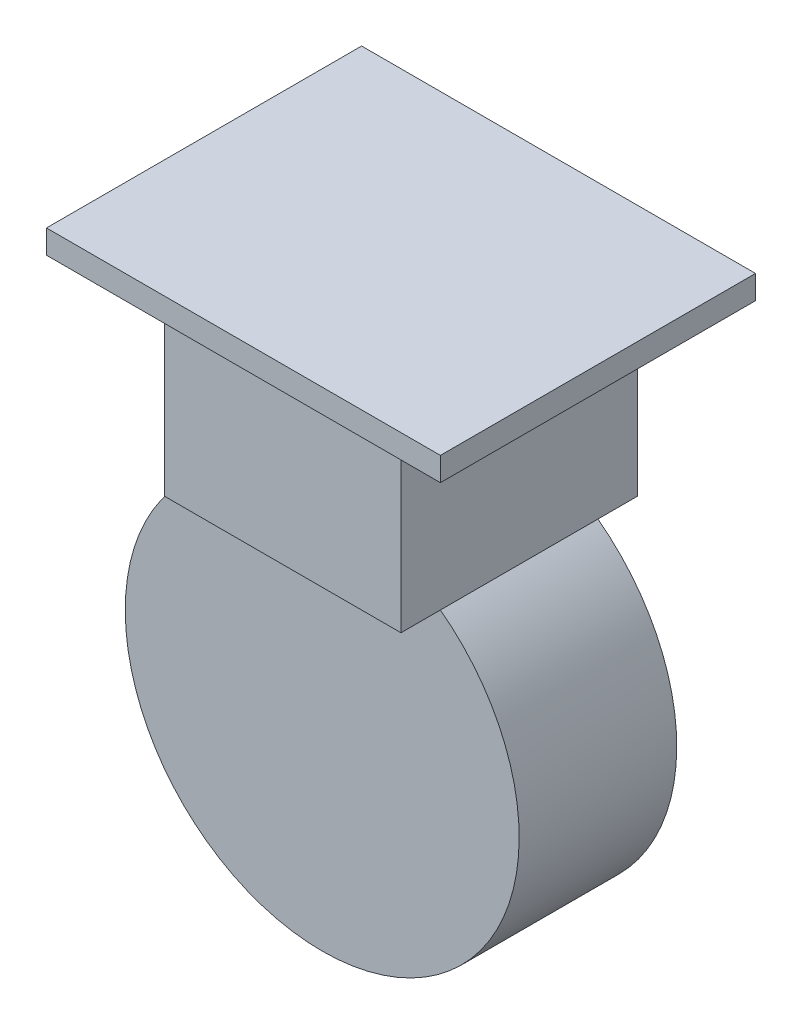
ISO-10303-21;
HEADER;
FILE_DESCRIPTION(('STEP AP214'),'2;1');
FILE_NAME('part.step','',(''),(''),'','','');
FILE_SCHEMA(('AUTOMOTIVE_DESIGN { 1 0 10303 214 1 1 1 1 }'));
ENDSEC;
DATA;
#1=APPLICATION_CONTEXT('core data for automotive mechanical design processes');
#2=APPLICATION_PROTOCOL_DEFINITION('international standard','automotive_design',2000,#1);
#3=PRODUCT_CONTEXT('',#1,'mechanical');
#4=PRODUCT('Part','Part','',(#3));
#5=PRODUCT_RELATED_PRODUCT_CATEGORY('part','',(#4));
#6=PRODUCT_DEFINITION_FORMATION('','',#4);
#7=PRODUCT_DEFINITION_CONTEXT('part definition',#1,'design');
#8=PRODUCT_DEFINITION('design','',#6,#7);
#9=PRODUCT_DEFINITION_SHAPE('','',#8);
#10=(LENGTH_UNIT() NAMED_UNIT(*) SI_UNIT(.MILLI.,.METRE.));
#11=(NAMED_UNIT(*) PLANE_ANGLE_UNIT() SI_UNIT($,.RADIAN.));
#12=(NAMED_UNIT(*) SI_UNIT($,.STERADIAN.) SOLID_ANGLE_UNIT());
#13=UNCERTAINTY_MEASURE_WITH_UNIT(LENGTH_MEASURE(1.E-05),#10,'distance_accuracy_value','');
#14=(GEOMETRIC_REPRESENTATION_CONTEXT(3) GLOBAL_UNCERTAINTY_ASSIGNED_CONTEXT((#13)) GLOBAL_UNIT_ASSIGNED_CONTEXT((#10,
#11,#12)) REPRESENTATION_CONTEXT('',''));
#15=CARTESIAN_POINT('',(0.,0.,0.));
#16=DIRECTION('',(0.,0.,1.));
#17=DIRECTION('',(1.,0.,0.));
#18=AXIS2_PLACEMENT_3D('',#15,#16,#17);
#19=CARTESIAN_POINT('',(0.,0.,-10.));
#20=DIRECTION('',(0.,0.,1.));
#21=DIRECTION('',(1.,0.,0.));
#22=AXIS2_PLACEMENT_3D('',#19,#20,#21);
#23=PLANE('',#22);
#24=DIRECTION('',(-1.,0.,0.));
#25=VECTOR('',#24,1.);
#26=CARTESIAN_POINT('',(0.,20.,-10.));
#27=LINE('',#26,#25);
#28=CARTESIAN_POINT('',(15.,20.,-10.));
#29=VERTEX_POINT('',#28);
#30=CARTESIAN_POINT('',(-15.,20.,-10.));
#31=VERTEX_POINT('',#30);
#32=EDGE_CURVE('E55',#29,#31,#27,.T.);
#33=ORIENTED_EDGE('',*,*,#32,.F.);
#34=CARTESIAN_POINT('',(0.,0.,-10.));
#35=DIRECTION('',(0.,0.,-1.));
#36=DIRECTION('',(-1.,0.,0.));
#37=AXIS2_PLACEMENT_3D('',#34,#35,#36);
#38=CIRCLE('',#37,25.);
#39=EDGE_CURVE('E46',#29,#31,#38,.T.);
#40=ORIENTED_EDGE('',*,*,#39,.T.);
#41=EDGE_LOOP('',(#33,#40));
#42=FACE_BOUND('',#41,.T.);
#43=ADVANCED_FACE('F39',(#42),#23,.F.);
#44=CARTESIAN_POINT('',(0.,0.,-15.));
#45=DIRECTION('',(0.,0.,-1.));
#46=DIRECTION('',(-1.,0.,0.));
#47=AXIS2_PLACEMENT_3D('',#44,#45,#46);
#48=CYLINDRICAL_SURFACE('',#47,25.);
#49=DIRECTION('',(0.,0.,-1.));
#50=VECTOR('',#49,1.);
#51=CARTESIAN_POINT('',(-15.,20.,15.));
#52=LINE('',#51,#50);
#53=CARTESIAN_POINT('',(-15.,20.,10.));
#54=VERTEX_POINT('',#53);
#55=EDGE_CURVE('E56',#54,#31,#52,.T.);
#56=ORIENTED_EDGE('',*,*,#55,.T.);
#57=ORIENTED_EDGE('',*,*,#39,.F.);
#58=DIRECTION('',(0.,0.,-1.));
#59=VECTOR('',#58,1.);
#60=CARTESIAN_POINT('',(15.,20.,15.));
#61=LINE('',#60,#59);
#62=CARTESIAN_POINT('',(15.,20.,10.));
#63=VERTEX_POINT('',#62);
#64=EDGE_CURVE('E178',#63,#29,#61,.T.);
#65=ORIENTED_EDGE('',*,*,#64,.F.);
#66=CARTESIAN_POINT('',(0.,0.,10.));
#67=DIRECTION('',(0.,0.,-1.));
#68=DIRECTION('',(-1.,0.,0.));
#69=AXIS2_PLACEMENT_3D('',#66,#67,#68);
#70=CIRCLE('',#69,25.);
#71=EDGE_CURVE('E181',#63,#54,#70,.T.);
#72=ORIENTED_EDGE('',*,*,#71,.T.);
#73=EDGE_LOOP('',(#56,#57,#65,#72));
#74=FACE_BOUND('',#73,.T.);
#75=ADVANCED_FACE('F206',(#74),#48,.T.);
#76=CARTESIAN_POINT('',(25.,0.,10.));
#77=DIRECTION('',(0.,0.,-1.));
#78=DIRECTION('',(-1.,0.,0.));
#79=AXIS2_PLACEMENT_3D('',#76,#77,#78);
#80=PLANE('',#79);
#81=DIRECTION('',(1.,0.,0.));
#82=VECTOR('',#81,1.);
#83=CARTESIAN_POINT('',(25.,20.,10.));
#84=LINE('',#83,#82);
#85=EDGE_CURVE('E11',#54,#63,#84,.T.);
#86=ORIENTED_EDGE('',*,*,#85,.F.);
#87=ORIENTED_EDGE('',*,*,#71,.F.);
#88=EDGE_LOOP('',(#86,#87));
#89=FACE_BOUND('',#88,.T.);
#90=ADVANCED_FACE('F209',(#89),#80,.F.);
#91=CARTESIAN_POINT('',(-15.,20.,15.));
#92=DIRECTION('',(0.,1.,0.));
#93=DIRECTION('',(0.,0.,1.));
#94=AXIS2_PLACEMENT_3D('',#91,#92,#93);
#95=PLANE('',#94);
#96=CARTESIAN_POINT('',(15.,20.,-15.));
#97=VERTEX_POINT('',#96);
#98=EDGE_CURVE('E174',#29,#97,#61,.T.);
#99=ORIENTED_EDGE('',*,*,#98,.F.);
#100=ORIENTED_EDGE('',*,*,#32,.T.);
#101=CARTESIAN_POINT('',(-15.,20.,-15.));
#102=VERTEX_POINT('',#101);
#103=EDGE_CURVE('E180',#31,#102,#52,.T.);
#104=ORIENTED_EDGE('',*,*,#103,.T.);
#105=DIRECTION('',(1.,0.,0.));
#106=VECTOR('',#105,1.);
#107=CARTESIAN_POINT('',(-15.,20.,-15.));
#108=LINE('',#107,#106);
#109=EDGE_CURVE('E144',#102,#97,#108,.T.);
#110=ORIENTED_EDGE('',*,*,#109,.T.);
#111=EDGE_LOOP('',(#99,#100,#104,#110));
#112=FACE_BOUND('',#111,.T.);
#113=ADVANCED_FACE('F189',(#112),#95,.F.);
#114=CARTESIAN_POINT('',(-15.,20.,15.));
#115=VERTEX_POINT('',#114);
#116=EDGE_CURVE('E179',#115,#54,#52,.T.);
#117=ORIENTED_EDGE('',*,*,#116,.T.);
#118=ORIENTED_EDGE('',*,*,#85,.T.);
#119=CARTESIAN_POINT('',(15.,20.,15.));
#120=VERTEX_POINT('',#119);
#121=EDGE_CURVE('E171',#120,#63,#61,.T.);
#122=ORIENTED_EDGE('',*,*,#121,.F.);
#123=DIRECTION('',(1.,0.,0.));
#124=VECTOR('',#123,1.);
#125=CARTESIAN_POINT('',(-15.,20.,15.));
#126=LINE('',#125,#124);
#127=EDGE_CURVE('E152',#115,#120,#126,.T.);
#128=ORIENTED_EDGE('',*,*,#127,.F.);
#129=EDGE_LOOP('',(#117,#118,#122,#128));
#130=FACE_BOUND('',#129,.T.);
#131=ADVANCED_FACE('F208',(#130),#95,.F.);
#132=CARTESIAN_POINT('',(-15.,44.,15.));
#133=DIRECTION('',(1.,0.,0.));
#134=DIRECTION('',(0.,0.,-1.));
#135=AXIS2_PLACEMENT_3D('',#132,#133,#134);
#136=PLANE('',#135);
#137=DIRECTION('',(0.,-1.,0.));
#138=VECTOR('',#137,1.);
#139=CARTESIAN_POINT('',(-15.,44.,-15.));
#140=LINE('',#139,#138);
#141=CARTESIAN_POINT('',(-15.,44.,-15.));
#142=VERTEX_POINT('',#141);
#143=EDGE_CURVE('E142',#142,#102,#140,.T.);
#144=ORIENTED_EDGE('',*,*,#143,.T.);
#145=ORIENTED_EDGE('',*,*,#103,.F.);
#146=ORIENTED_EDGE('',*,*,#55,.F.);
#147=ORIENTED_EDGE('',*,*,#116,.F.);
#148=DIRECTION('',(0.,-1.,0.));
#149=VECTOR('',#148,1.);
#150=CARTESIAN_POINT('',(-15.,44.,15.));
#151=LINE('',#150,#149);
#152=CARTESIAN_POINT('',(-15.,44.,15.));
#153=VERTEX_POINT('',#152);
#154=EDGE_CURVE('E151',#153,#115,#151,.T.);
#155=ORIENTED_EDGE('',*,*,#154,.F.);
#156=DIRECTION('',(0.,0.,-1.));
#157=VECTOR('',#156,1.);
#158=CARTESIAN_POINT('',(-15.,44.,15.));
#159=LINE('',#158,#157);
#160=EDGE_CURVE('E159',#153,#142,#159,.T.);
#161=ORIENTED_EDGE('',*,*,#160,.T.);
#162=EDGE_LOOP('',(#144,#145,#146,#147,#155,#161));
#163=FACE_BOUND('',#162,.T.);
#164=ADVANCED_FACE('F195',(#163),#136,.F.);
#165=CARTESIAN_POINT('',(15.,20.,15.));
#166=DIRECTION('',(-1.,0.,0.));
#167=DIRECTION('',(0.,0.,1.));
#168=AXIS2_PLACEMENT_3D('',#165,#166,#167);
#169=PLANE('',#168);
#170=DIRECTION('',(0.,1.,0.));
#171=VECTOR('',#170,1.);
#172=CARTESIAN_POINT('',(15.,20.,-15.));
#173=LINE('',#172,#171);
#174=CARTESIAN_POINT('',(15.,44.,-15.));
#175=VERTEX_POINT('',#174);
#176=EDGE_CURVE('E163',#97,#175,#173,.T.);
#177=ORIENTED_EDGE('',*,*,#176,.T.);
#178=DIRECTION('',(0.,0.,-1.));
#179=VECTOR('',#178,1.);
#180=CARTESIAN_POINT('',(15.,44.,15.));
#181=LINE('',#180,#179);
#182=CARTESIAN_POINT('',(15.,44.,15.));
#183=VERTEX_POINT('',#182);
#184=EDGE_CURVE('E168',#183,#175,#181,.T.);
#185=ORIENTED_EDGE('',*,*,#184,.F.);
#186=DIRECTION('',(0.,1.,0.));
#187=VECTOR('',#186,1.);
#188=CARTESIAN_POINT('',(15.,20.,15.));
#189=LINE('',#188,#187);
#190=EDGE_CURVE('E160',#120,#183,#189,.T.);
#191=ORIENTED_EDGE('',*,*,#190,.F.);
#192=ORIENTED_EDGE('',*,*,#121,.T.);
#193=ORIENTED_EDGE('',*,*,#64,.T.);
#194=ORIENTED_EDGE('',*,*,#98,.T.);
#195=EDGE_LOOP('',(#177,#185,#191,#192,#193,#194));
#196=FACE_BOUND('',#195,.T.);
#197=ADVANCED_FACE('F204',(#196),#169,.F.);
#198=CARTESIAN_POINT('',(0.,0.,15.));
#199=DIRECTION('',(0.,0.,1.));
#200=DIRECTION('',(1.,0.,0.));
#201=AXIS2_PLACEMENT_3D('',#198,#199,#200);
#202=PLANE('',#201);
#203=ORIENTED_EDGE('',*,*,#154,.T.);
#204=ORIENTED_EDGE('',*,*,#127,.T.);
#205=ORIENTED_EDGE('',*,*,#190,.T.);
#206=DIRECTION('',(-1.,0.,0.));
#207=VECTOR('',#206,1.);
#208=CARTESIAN_POINT('',(15.,44.,15.));
#209=LINE('',#208,#207);
#210=EDGE_CURVE('E157',#183,#153,#209,.T.);
#211=ORIENTED_EDGE('',*,*,#210,.T.);
#212=EDGE_LOOP('',(#203,#204,#205,#211));
#213=FACE_BOUND('',#212,.T.);
#214=ADVANCED_FACE('F265',(#213),#202,.T.);
#215=CARTESIAN_POINT('',(0.,0.,-15.));
#216=DIRECTION('',(0.,0.,1.));
#217=DIRECTION('',(1.,0.,0.));
#218=AXIS2_PLACEMENT_3D('',#215,#216,#217);
#219=PLANE('',#218);
#220=ORIENTED_EDGE('',*,*,#143,.F.);
#221=DIRECTION('',(-1.,0.,0.));
#222=VECTOR('',#221,1.);
#223=CARTESIAN_POINT('',(15.,44.,-15.));
#224=LINE('',#223,#222);
#225=EDGE_CURVE('E154',#175,#142,#224,.T.);
#226=ORIENTED_EDGE('',*,*,#225,.F.);
#227=ORIENTED_EDGE('',*,*,#176,.F.);
#228=ORIENTED_EDGE('',*,*,#109,.F.);
#229=EDGE_LOOP('',(#220,#226,#227,#228));
#230=FACE_BOUND('',#229,.T.);
#231=ADVANCED_FACE('F196',(#230),#219,.F.);
#232=CARTESIAN_POINT('',(-25.,44.,20.));
#233=DIRECTION('',(0.,1.,0.));
#234=DIRECTION('',(0.,0.,1.));
#235=AXIS2_PLACEMENT_3D('',#232,#233,#234);
#236=PLANE('',#235);
#237=DIRECTION('',(1.,0.,0.));
#238=VECTOR('',#237,1.);
#239=CARTESIAN_POINT('',(-25.,44.,-20.));
#240=LINE('',#239,#238);
#241=CARTESIAN_POINT('',(-25.,44.,-20.));
#242=VERTEX_POINT('',#241);
#243=CARTESIAN_POINT('',(25.,44.,-20.));
#244=VERTEX_POINT('',#243);
#245=EDGE_CURVE('E339',#242,#244,#240,.T.);
#246=ORIENTED_EDGE('',*,*,#245,.T.);
#247=DIRECTION('',(0.,0.,-1.));
#248=VECTOR('',#247,1.);
#249=CARTESIAN_POINT('',(25.,44.,20.));
#250=LINE('',#249,#248);
#251=CARTESIAN_POINT('',(25.,44.,20.));
#252=VERTEX_POINT('',#251);
#253=EDGE_CURVE('E124',#252,#244,#250,.T.);
#254=ORIENTED_EDGE('',*,*,#253,.F.);
#255=DIRECTION('',(1.,0.,0.));
#256=VECTOR('',#255,1.);
#257=CARTESIAN_POINT('',(-25.,44.,20.));
#258=LINE('',#257,#256);
#259=CARTESIAN_POINT('',(-25.,44.,20.));
#260=VERTEX_POINT('',#259);
#261=EDGE_CURVE('E117',#260,#252,#258,.T.);
#262=ORIENTED_EDGE('',*,*,#261,.F.);
#263=DIRECTION('',(0.,0.,-1.));
#264=VECTOR('',#263,1.);
#265=CARTESIAN_POINT('',(-25.,44.,20.));
#266=LINE('',#265,#264);
#267=EDGE_CURVE('E122',#260,#242,#266,.T.);
#268=ORIENTED_EDGE('',*,*,#267,.T.);
#269=EDGE_LOOP('',(#246,#254,#262,#268));
#270=FACE_BOUND('',#269,.T.);
#271=ORIENTED_EDGE('',*,*,#184,.T.);
#272=ORIENTED_EDGE('',*,*,#225,.T.);
#273=ORIENTED_EDGE('',*,*,#160,.F.);
#274=ORIENTED_EDGE('',*,*,#210,.F.);
#275=EDGE_LOOP('',(#271,#272,#273,#274));
#276=FACE_BOUND('',#275,.T.);
#277=ADVANCED_FACE('F119',(#270,#276),#236,.F.);
#278=CARTESIAN_POINT('',(-25.,47.,20.));
#279=DIRECTION('',(1.,0.,0.));
#280=DIRECTION('',(0.,0.,-1.));
#281=AXIS2_PLACEMENT_3D('',#278,#279,#280);
#282=PLANE('',#281);
#283=DIRECTION('',(0.,-1.,0.));
#284=VECTOR('',#283,1.);
#285=CARTESIAN_POINT('',(-25.,47.,-20.));
#286=LINE('',#285,#284);
#287=CARTESIAN_POINT('',(-25.,47.,-20.));
#288=VERTEX_POINT('',#287);
#289=EDGE_CURVE('E143',#288,#242,#286,.T.);
#290=ORIENTED_EDGE('',*,*,#289,.T.);
#291=ORIENTED_EDGE('',*,*,#267,.F.);
#292=DIRECTION('',(0.,-1.,0.));
#293=VECTOR('',#292,1.);
#294=CARTESIAN_POINT('',(-25.,47.,20.));
#295=LINE('',#294,#293);
#296=CARTESIAN_POINT('',(-25.,47.,20.));
#297=VERTEX_POINT('',#296);
#298=EDGE_CURVE('E126',#297,#260,#295,.T.);
#299=ORIENTED_EDGE('',*,*,#298,.F.);
#300=DIRECTION('',(0.,0.,-1.));
#301=VECTOR('',#300,1.);
#302=CARTESIAN_POINT('',(-25.,47.,20.));
#303=LINE('',#302,#301);
#304=EDGE_CURVE('E350',#297,#288,#303,.T.);
#305=ORIENTED_EDGE('',*,*,#304,.T.);
#306=EDGE_LOOP('',(#290,#291,#299,#305));
#307=FACE_BOUND('',#306,.T.);
#308=ADVANCED_FACE('F139',(#307),#282,.F.);
#309=CARTESIAN_POINT('',(25.,44.,20.));
#310=DIRECTION('',(-1.,0.,0.));
#311=DIRECTION('',(0.,0.,1.));
#312=AXIS2_PLACEMENT_3D('',#309,#310,#311);
#313=PLANE('',#312);
#314=DIRECTION('',(0.,1.,0.));
#315=VECTOR('',#314,1.);
#316=CARTESIAN_POINT('',(25.,44.,-20.));
#317=LINE('',#316,#315);
#318=CARTESIAN_POINT('',(25.,47.,-20.));
#319=VERTEX_POINT('',#318);
#320=EDGE_CURVE('E338',#244,#319,#317,.T.);
#321=ORIENTED_EDGE('',*,*,#320,.T.);
#322=DIRECTION('',(0.,0.,-1.));
#323=VECTOR('',#322,1.);
#324=CARTESIAN_POINT('',(25.,47.,20.));
#325=LINE('',#324,#323);
#326=CARTESIAN_POINT('',(25.,47.,20.));
#327=VERTEX_POINT('',#326);
#328=EDGE_CURVE('E150',#327,#319,#325,.T.);
#329=ORIENTED_EDGE('',*,*,#328,.F.);
#330=DIRECTION('',(0.,1.,0.));
#331=VECTOR('',#330,1.);
#332=CARTESIAN_POINT('',(25.,44.,20.));
#333=LINE('',#332,#331);
#334=EDGE_CURVE('E130',#252,#327,#333,.T.);
#335=ORIENTED_EDGE('',*,*,#334,.F.);
#336=ORIENTED_EDGE('',*,*,#253,.T.);
#337=EDGE_LOOP('',(#321,#329,#335,#336));
#338=FACE_BOUND('',#337,.T.);
#339=ADVANCED_FACE('F297',(#338),#313,.F.);
#340=CARTESIAN_POINT('',(25.,47.,20.));
#341=DIRECTION('',(0.,-1.,0.));
#342=DIRECTION('',(0.,0.,-1.));
#343=AXIS2_PLACEMENT_3D('',#340,#341,#342);
#344=PLANE('',#343);
#345=DIRECTION('',(-1.,0.,0.));
#346=VECTOR('',#345,1.);
#347=CARTESIAN_POINT('',(25.,47.,-20.));
#348=LINE('',#347,#346);
#349=EDGE_CURVE('E140',#319,#288,#348,.T.);
#350=ORIENTED_EDGE('',*,*,#349,.T.);
#351=ORIENTED_EDGE('',*,*,#304,.F.);
#352=DIRECTION('',(-1.,0.,0.));
#353=VECTOR('',#352,1.);
#354=CARTESIAN_POINT('',(25.,47.,20.));
#355=LINE('',#354,#353);
#356=EDGE_CURVE('E134',#327,#297,#355,.T.);
#357=ORIENTED_EDGE('',*,*,#356,.F.);
#358=ORIENTED_EDGE('',*,*,#328,.T.);
#359=EDGE_LOOP('',(#350,#351,#357,#358));
#360=FACE_BOUND('',#359,.T.);
#361=ADVANCED_FACE('F301',(#360),#344,.F.);
#362=CARTESIAN_POINT('',(0.,0.,20.));
#363=DIRECTION('',(0.,0.,1.));
#364=DIRECTION('',(1.,0.,0.));
#365=AXIS2_PLACEMENT_3D('',#362,#363,#364);
#366=PLANE('',#365);
#367=ORIENTED_EDGE('',*,*,#298,.T.);
#368=ORIENTED_EDGE('',*,*,#261,.T.);
#369=ORIENTED_EDGE('',*,*,#334,.T.);
#370=ORIENTED_EDGE('',*,*,#356,.T.);
#371=EDGE_LOOP('',(#367,#368,#369,#370));
#372=FACE_BOUND('',#371,.T.);
#373=ADVANCED_FACE('F132',(#372),#366,.T.);
#374=CARTESIAN_POINT('',(0.,0.,-20.));
#375=DIRECTION('',(0.,0.,1.));
#376=DIRECTION('',(1.,0.,0.));
#377=AXIS2_PLACEMENT_3D('',#374,#375,#376);
#378=PLANE('',#377);
#379=ORIENTED_EDGE('',*,*,#289,.F.);
#380=ORIENTED_EDGE('',*,*,#349,.F.);
#381=ORIENTED_EDGE('',*,*,#320,.F.);
#382=ORIENTED_EDGE('',*,*,#245,.F.);
#383=EDGE_LOOP('',(#379,#380,#381,#382));
#384=FACE_BOUND('',#383,.T.);
#385=ADVANCED_FACE('F322',(#384),#378,.F.);
#386=CLOSED_SHELL('',(#43,#75,#90,#113,#131,#164,#197,#214,#231,#277,#308,#339,#361,#373,#385));
#387=MANIFOLD_SOLID_BREP('B2',#386);
#388=ADVANCED_BREP_SHAPE_REPRESENTATION('',(#18,#387),#14);
#389=SHAPE_DEFINITION_REPRESENTATION(#9,#388);
ENDSEC;
END-ISO-10303-21;
